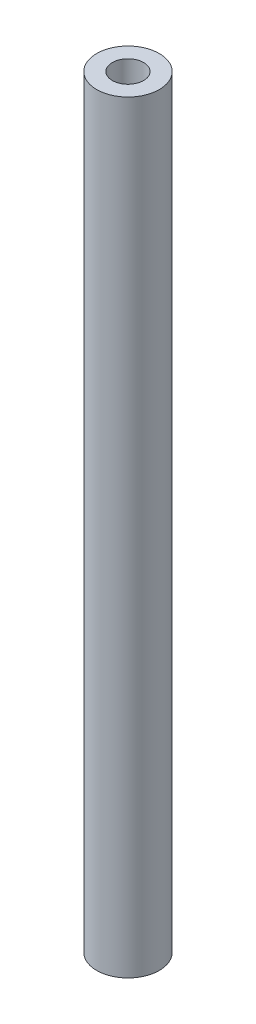
ISO-10303-21;
HEADER;
FILE_DESCRIPTION(('STEP AP214'),'2;1');
FILE_NAME('part.step','',(''),(''),'','','');
FILE_SCHEMA(('AUTOMOTIVE_DESIGN { 1 0 10303 214 1 1 1 1 }'));
ENDSEC;
DATA;
#1=APPLICATION_CONTEXT('core data for automotive mechanical design processes');
#2=APPLICATION_PROTOCOL_DEFINITION('international standard','automotive_design',2000,#1);
#3=PRODUCT_CONTEXT('',#1,'mechanical');
#4=PRODUCT('Part','Part','',(#3));
#5=PRODUCT_RELATED_PRODUCT_CATEGORY('part','',(#4));
#6=PRODUCT_DEFINITION_FORMATION('','',#4);
#7=PRODUCT_DEFINITION_CONTEXT('part definition',#1,'design');
#8=PRODUCT_DEFINITION('design','',#6,#7);
#9=PRODUCT_DEFINITION_SHAPE('','',#8);
#10=(LENGTH_UNIT() NAMED_UNIT(*) SI_UNIT(.MILLI.,.METRE.));
#11=(NAMED_UNIT(*) PLANE_ANGLE_UNIT() SI_UNIT($,.RADIAN.));
#12=(NAMED_UNIT(*) SI_UNIT($,.STERADIAN.) SOLID_ANGLE_UNIT());
#13=UNCERTAINTY_MEASURE_WITH_UNIT(LENGTH_MEASURE(1.E-05),#10,'distance_accuracy_value','');
#14=(GEOMETRIC_REPRESENTATION_CONTEXT(3) GLOBAL_UNCERTAINTY_ASSIGNED_CONTEXT((#13)) GLOBAL_UNIT_ASSIGNED_CONTEXT((#10,
#11,#12)) REPRESENTATION_CONTEXT('',''));
#15=CARTESIAN_POINT('',(0.,0.,0.));
#16=DIRECTION('',(0.,0.,1.));
#17=DIRECTION('',(1.,0.,0.));
#18=AXIS2_PLACEMENT_3D('',#15,#16,#17);
#19=CARTESIAN_POINT('',(0.,24.4,0.));
#20=DIRECTION('',(0.,1.,0.));
#21=DIRECTION('',(0.,0.,1.));
#22=AXIS2_PLACEMENT_3D('',#19,#20,#21);
#23=PLANE('',#22);
#24=CARTESIAN_POINT('',(0.,24.4,0.));
#25=DIRECTION('',(0.,1.,0.));
#26=DIRECTION('',(0.,0.,1.));
#27=AXIS2_PLACEMENT_3D('',#24,#25,#26);
#28=CIRCLE('',#27,2.);
#29=CARTESIAN_POINT('',(0.,24.4,2.));
#30=VERTEX_POINT('',#29);
#31=EDGE_CURVE('E10',#30,#30,#28,.T.);
#32=ORIENTED_EDGE('',*,*,#31,.T.);
#33=EDGE_LOOP('',(#32));
#34=FACE_BOUND('',#33,.T.);
#35=CARTESIAN_POINT('',(0.,24.4,0.));
#36=DIRECTION('',(0.,1.,0.));
#37=DIRECTION('',(0.,0.,1.));
#38=AXIS2_PLACEMENT_3D('',#35,#36,#37);
#39=CIRCLE('',#38,1.);
#40=CARTESIAN_POINT('',(0.,24.4,1.));
#41=VERTEX_POINT('',#40);
#42=EDGE_CURVE('E41',#41,#41,#39,.T.);
#43=ORIENTED_EDGE('',*,*,#42,.F.);
#44=EDGE_LOOP('',(#43));
#45=FACE_BOUND('',#44,.T.);
#46=ADVANCED_FACE('F30',(#34,#45),#23,.T.);
#47=CARTESIAN_POINT('',(0.,-24.4,0.));
#48=DIRECTION('',(0.,1.,0.));
#49=DIRECTION('',(0.,0.,1.));
#50=AXIS2_PLACEMENT_3D('',#47,#48,#49);
#51=PLANE('',#50);
#52=CARTESIAN_POINT('',(0.,-24.4,0.));
#53=DIRECTION('',(0.,1.,0.));
#54=DIRECTION('',(0.,0.,1.));
#55=AXIS2_PLACEMENT_3D('',#52,#53,#54);
#56=CIRCLE('',#55,2.);
#57=CARTESIAN_POINT('',(0.,-24.4,2.));
#58=VERTEX_POINT('',#57);
#59=EDGE_CURVE('E34',#58,#58,#56,.T.);
#60=ORIENTED_EDGE('',*,*,#59,.F.);
#61=EDGE_LOOP('',(#60));
#62=FACE_BOUND('',#61,.T.);
#63=CARTESIAN_POINT('',(0.,-24.4,0.));
#64=DIRECTION('',(0.,1.,0.));
#65=DIRECTION('',(0.,0.,1.));
#66=AXIS2_PLACEMENT_3D('',#63,#64,#65);
#67=CIRCLE('',#66,1.);
#68=CARTESIAN_POINT('',(0.,-24.4,1.));
#69=VERTEX_POINT('',#68);
#70=EDGE_CURVE('E43',#69,#69,#67,.T.);
#71=ORIENTED_EDGE('',*,*,#70,.T.);
#72=EDGE_LOOP('',(#71));
#73=FACE_BOUND('',#72,.T.);
#74=ADVANCED_FACE('F53',(#62,#73),#51,.F.);
#75=CARTESIAN_POINT('',(0.,24.4,0.));
#76=DIRECTION('',(0.,-1.,0.));
#77=DIRECTION('',(0.,0.,-1.));
#78=AXIS2_PLACEMENT_3D('',#75,#76,#77);
#79=CYLINDRICAL_SURFACE('',#78,2.);
#80=ORIENTED_EDGE('',*,*,#31,.F.);
#81=EDGE_LOOP('',(#80));
#82=FACE_BOUND('',#81,.T.);
#83=ORIENTED_EDGE('',*,*,#59,.T.);
#84=EDGE_LOOP('',(#83));
#85=FACE_BOUND('',#84,.T.);
#86=ADVANCED_FACE('F32',(#82,#85),#79,.T.);
#87=CARTESIAN_POINT('',(0.,24.4,0.));
#88=DIRECTION('',(0.,-1.,0.));
#89=DIRECTION('',(0.,0.,-1.));
#90=AXIS2_PLACEMENT_3D('',#87,#88,#89);
#91=CYLINDRICAL_SURFACE('',#90,1.);
#92=ORIENTED_EDGE('',*,*,#42,.T.);
#93=EDGE_LOOP('',(#92));
#94=FACE_BOUND('',#93,.T.);
#95=ORIENTED_EDGE('',*,*,#70,.F.);
#96=EDGE_LOOP('',(#95));
#97=FACE_BOUND('',#96,.T.);
#98=ADVANCED_FACE('F49',(#94,#97),#91,.F.);
#99=CLOSED_SHELL('',(#46,#74,#86,#98));
#100=MANIFOLD_SOLID_BREP('B2',#99);
#101=ADVANCED_BREP_SHAPE_REPRESENTATION('',(#18,#100),#14);
#102=SHAPE_DEFINITION_REPRESENTATION(#9,#101);
ENDSEC;
END-ISO-10303-21;
